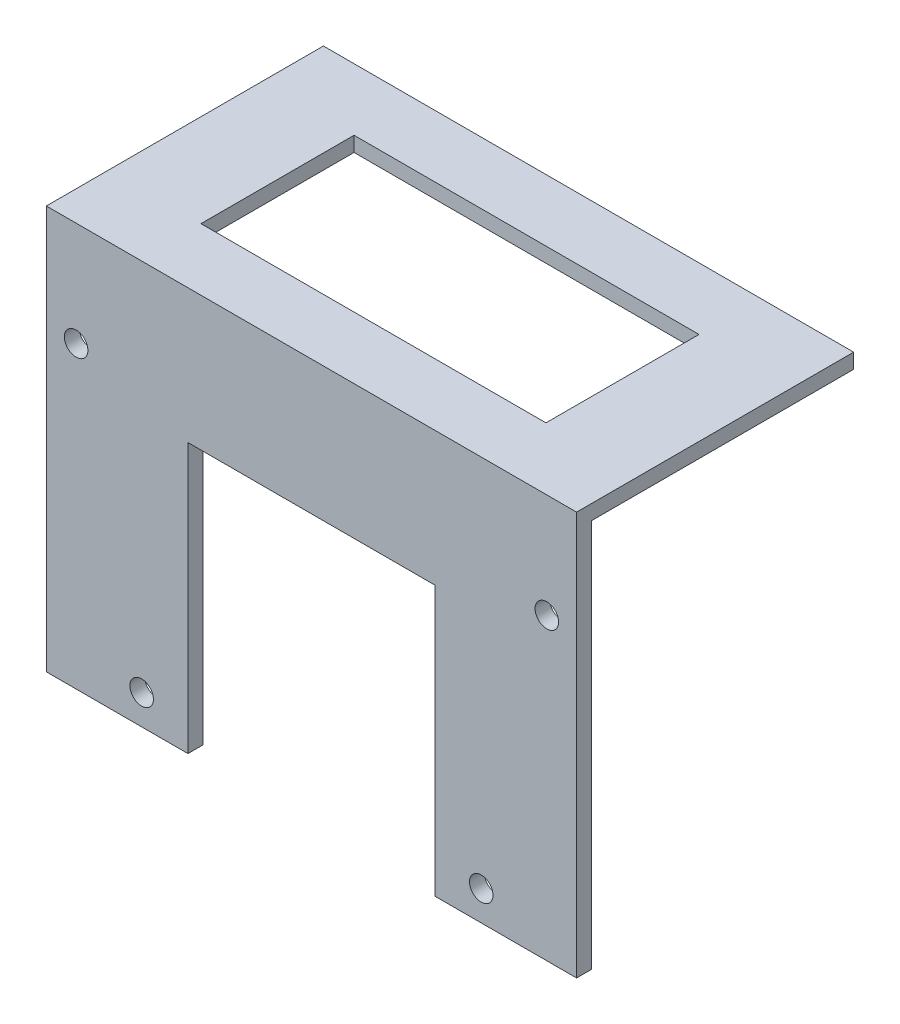
ISO-10303-21;
HEADER;
FILE_DESCRIPTION(('STEP AP214'),'2;1');
FILE_NAME('part.step','',(''),(''),'','','');
FILE_SCHEMA(('AUTOMOTIVE_DESIGN { 1 0 10303 214 1 1 1 1 }'));
ENDSEC;
DATA;
#1=APPLICATION_CONTEXT('core data for automotive mechanical design processes');
#2=APPLICATION_PROTOCOL_DEFINITION('international standard','automotive_design',2000,#1);
#3=PRODUCT_CONTEXT('',#1,'mechanical');
#4=PRODUCT('Part','Part','',(#3));
#5=PRODUCT_RELATED_PRODUCT_CATEGORY('part','',(#4));
#6=PRODUCT_DEFINITION_FORMATION('','',#4);
#7=PRODUCT_DEFINITION_CONTEXT('part definition',#1,'design');
#8=PRODUCT_DEFINITION('design','',#6,#7);
#9=PRODUCT_DEFINITION_SHAPE('','',#8);
#10=(LENGTH_UNIT() NAMED_UNIT(*) SI_UNIT(.MILLI.,.METRE.));
#11=(NAMED_UNIT(*) PLANE_ANGLE_UNIT() SI_UNIT($,.RADIAN.));
#12=(NAMED_UNIT(*) SI_UNIT($,.STERADIAN.) SOLID_ANGLE_UNIT());
#13=UNCERTAINTY_MEASURE_WITH_UNIT(LENGTH_MEASURE(1.E-05),#10,'distance_accuracy_value','');
#14=(GEOMETRIC_REPRESENTATION_CONTEXT(3) GLOBAL_UNCERTAINTY_ASSIGNED_CONTEXT((#13)) GLOBAL_UNIT_ASSIGNED_CONTEXT((#10,
#11,#12)) REPRESENTATION_CONTEXT('',''));
#15=CARTESIAN_POINT('',(0.,0.,0.));
#16=DIRECTION('',(0.,0.,1.));
#17=DIRECTION('',(1.,0.,0.));
#18=AXIS2_PLACEMENT_3D('',#15,#16,#17);
#19=CARTESIAN_POINT('',(-8.910000095367,75.81,-3.175));
#20=DIRECTION('',(-1.,0.,0.));
#21=DIRECTION('',(0.,0.,1.));
#22=AXIS2_PLACEMENT_3D('',#19,#20,#21);
#23=PLANE('',#22);
#24=DIRECTION('',(0.,-1.,0.));
#25=VECTOR('',#24,1.);
#26=CARTESIAN_POINT('',(-8.910000095367,75.81,0.));
#27=LINE('',#26,#25);
#28=CARTESIAN_POINT('',(-8.910000095367,78.985,0.));
#29=VERTEX_POINT('',#28);
#30=CARTESIAN_POINT('',(-8.910000095367,-7.01,0.));
#31=VERTEX_POINT('',#30);
#32=EDGE_CURVE('E211',#29,#31,#27,.T.);
#33=ORIENTED_EDGE('',*,*,#32,.F.);
#34=DIRECTION('',(0.,0.,1.));
#35=VECTOR('',#34,1.);
#36=CARTESIAN_POINT('',(-8.910000095367,78.985,0.));
#37=LINE('',#36,#35);
#38=CARTESIAN_POINT('',(-8.910000095367,78.985,-59.055));
#39=VERTEX_POINT('',#38);
#40=EDGE_CURVE('E166',#39,#29,#37,.T.);
#41=ORIENTED_EDGE('',*,*,#40,.F.);
#42=DIRECTION('',(0.,-1.,0.));
#43=VECTOR('',#42,1.);
#44=CARTESIAN_POINT('',(-8.910000095367,78.985,-59.055));
#45=LINE('',#44,#43);
#46=CARTESIAN_POINT('',(-8.910000095367,75.81,-59.055));
#47=VERTEX_POINT('',#46);
#48=EDGE_CURVE('E178',#39,#47,#45,.T.);
#49=ORIENTED_EDGE('',*,*,#48,.T.);
#50=DIRECTION('',(0.,0.,1.));
#51=VECTOR('',#50,1.);
#52=CARTESIAN_POINT('',(-8.910000095367,75.81,-3.175));
#53=LINE('',#52,#51);
#54=CARTESIAN_POINT('',(-8.910000095367,75.81,-3.175));
#55=VERTEX_POINT('',#54);
#56=EDGE_CURVE('E170',#47,#55,#53,.T.);
#57=ORIENTED_EDGE('',*,*,#56,.T.);
#58=DIRECTION('',(0.,-1.,0.));
#59=VECTOR('',#58,1.);
#60=CARTESIAN_POINT('',(-8.910000095367,75.81,-3.175));
#61=LINE('',#60,#59);
#62=CARTESIAN_POINT('',(-8.910000095367,-7.01,-3.175));
#63=VERTEX_POINT('',#62);
#64=EDGE_CURVE('E214',#55,#63,#61,.T.);
#65=ORIENTED_EDGE('',*,*,#64,.T.);
#66=DIRECTION('',(0.,0.,1.));
#67=VECTOR('',#66,1.);
#68=CARTESIAN_POINT('',(-8.910000095367,-7.01,-3.175));
#69=LINE('',#68,#67);
#70=EDGE_CURVE('E239',#63,#31,#69,.T.);
#71=ORIENTED_EDGE('',*,*,#70,.T.);
#72=EDGE_LOOP('',(#33,#41,#49,#57,#65,#71));
#73=FACE_BOUND('',#72,.T.);
#74=ADVANCED_FACE('F38',(#73),#23,.T.);
#75=CARTESIAN_POINT('',(104.109998474121,75.81,-3.175));
#76=DIRECTION('',(1.,0.,0.));
#77=DIRECTION('',(0.,0.,-1.));
#78=AXIS2_PLACEMENT_3D('',#75,#76,#77);
#79=PLANE('',#78);
#80=DIRECTION('',(0.,1.,0.));
#81=VECTOR('',#80,1.);
#82=CARTESIAN_POINT('',(104.109998474121,75.81,0.));
#83=LINE('',#82,#81);
#84=CARTESIAN_POINT('',(104.109998474121,-7.00999999999994,0.));
#85=VERTEX_POINT('',#84);
#86=CARTESIAN_POINT('',(104.109998474121,78.985,0.));
#87=VERTEX_POINT('',#86);
#88=EDGE_CURVE('E218',#85,#87,#83,.T.);
#89=ORIENTED_EDGE('',*,*,#88,.F.);
#90=DIRECTION('',(0.,0.,1.));
#91=VECTOR('',#90,1.);
#92=CARTESIAN_POINT('',(104.109998474121,-7.00999999999994,-3.175));
#93=LINE('',#92,#91);
#94=CARTESIAN_POINT('',(104.109998474121,-7.00999999999994,-3.175));
#95=VERTEX_POINT('',#94);
#96=EDGE_CURVE('E258',#95,#85,#93,.T.);
#97=ORIENTED_EDGE('',*,*,#96,.F.);
#98=DIRECTION('',(0.,1.,0.));
#99=VECTOR('',#98,1.);
#100=CARTESIAN_POINT('',(104.109998474121,75.81,-3.175));
#101=LINE('',#100,#99);
#102=CARTESIAN_POINT('',(104.109998474121,75.81,-3.175));
#103=VERTEX_POINT('',#102);
#104=EDGE_CURVE('E233',#95,#103,#101,.T.);
#105=ORIENTED_EDGE('',*,*,#104,.T.);
#106=DIRECTION('',(0.,0.,-1.));
#107=VECTOR('',#106,1.);
#108=CARTESIAN_POINT('',(104.109998474121,75.81,-59.055));
#109=LINE('',#108,#107);
#110=CARTESIAN_POINT('',(104.109998474121,75.81,-59.055));
#111=VERTEX_POINT('',#110);
#112=EDGE_CURVE('E163',#103,#111,#109,.T.);
#113=ORIENTED_EDGE('',*,*,#112,.T.);
#114=DIRECTION('',(0.,-1.,0.));
#115=VECTOR('',#114,1.);
#116=CARTESIAN_POINT('',(104.109998474121,78.985,-59.055));
#117=LINE('',#116,#115);
#118=CARTESIAN_POINT('',(104.109998474121,78.985,-59.055));
#119=VERTEX_POINT('',#118);
#120=EDGE_CURVE('E186',#119,#111,#117,.T.);
#121=ORIENTED_EDGE('',*,*,#120,.F.);
#122=DIRECTION('',(0.,0.,-1.));
#123=VECTOR('',#122,1.);
#124=CARTESIAN_POINT('',(104.109998474121,78.985,-59.055));
#125=LINE('',#124,#123);
#126=EDGE_CURVE('E173',#87,#119,#125,.T.);
#127=ORIENTED_EDGE('',*,*,#126,.F.);
#128=EDGE_LOOP('',(#89,#97,#105,#113,#121,#127));
#129=FACE_BOUND('',#128,.T.);
#130=ADVANCED_FACE('F291',(#129),#79,.T.);
#131=CARTESIAN_POINT('',(104.109998474121,-7.00999999999994,-3.175));
#132=DIRECTION('',(0.,-1.,0.));
#133=DIRECTION('',(0.,0.,-1.));
#134=AXIS2_PLACEMENT_3D('',#131,#132,#133);
#135=PLANE('',#134);
#136=DIRECTION('',(1.,0.,0.));
#137=VECTOR('',#136,1.);
#138=CARTESIAN_POINT('',(104.109998474121,-7.00999999999994,0.));
#139=LINE('',#138,#137);
#140=CARTESIAN_POINT('',(73.9315308865306,-7.00999999999994,0.));
#141=VERTEX_POINT('',#140);
#142=EDGE_CURVE('E254',#141,#85,#139,.T.);
#143=ORIENTED_EDGE('',*,*,#142,.F.);
#144=DIRECTION('',(0.,0.,1.));
#145=VECTOR('',#144,1.);
#146=CARTESIAN_POINT('',(73.9315308865306,-7.00999999999994,-3.175));
#147=LINE('',#146,#145);
#148=CARTESIAN_POINT('',(73.9315308865306,-7.00999999999994,-3.175));
#149=VERTEX_POINT('',#148);
#150=EDGE_CURVE('E261',#149,#141,#147,.T.);
#151=ORIENTED_EDGE('',*,*,#150,.F.);
#152=DIRECTION('',(1.,0.,0.));
#153=VECTOR('',#152,1.);
#154=CARTESIAN_POINT('',(104.109998474121,-7.00999999999994,-3.175));
#155=LINE('',#154,#153);
#156=EDGE_CURVE('E230',#149,#95,#155,.T.);
#157=ORIENTED_EDGE('',*,*,#156,.T.);
#158=ORIENTED_EDGE('',*,*,#96,.T.);
#159=EDGE_LOOP('',(#143,#151,#157,#158));
#160=FACE_BOUND('',#159,.T.);
#161=ADVANCED_FACE('F296',(#160),#135,.T.);
#162=CARTESIAN_POINT('',(73.9315308865306,50.41,-3.175));
#163=DIRECTION('',(-1.,0.,0.));
#164=DIRECTION('',(0.,0.,1.));
#165=AXIS2_PLACEMENT_3D('',#162,#163,#164);
#166=PLANE('',#165);
#167=DIRECTION('',(0.,-1.,0.));
#168=VECTOR('',#167,1.);
#169=CARTESIAN_POINT('',(73.9315308865306,50.41,0.));
#170=LINE('',#169,#168);
#171=CARTESIAN_POINT('',(73.9315308865306,50.41,0.));
#172=VERTEX_POINT('',#171);
#173=EDGE_CURVE('E251',#172,#141,#170,.T.);
#174=ORIENTED_EDGE('',*,*,#173,.F.);
#175=DIRECTION('',(0.,0.,1.));
#176=VECTOR('',#175,1.);
#177=CARTESIAN_POINT('',(73.9315308865306,50.41,-3.175));
#178=LINE('',#177,#176);
#179=CARTESIAN_POINT('',(73.9315308865306,50.41,-3.175));
#180=VERTEX_POINT('',#179);
#181=EDGE_CURVE('E263',#180,#172,#178,.T.);
#182=ORIENTED_EDGE('',*,*,#181,.F.);
#183=DIRECTION('',(0.,-1.,0.));
#184=VECTOR('',#183,1.);
#185=CARTESIAN_POINT('',(73.9315308865306,50.41,-3.175));
#186=LINE('',#185,#184);
#187=EDGE_CURVE('E227',#180,#149,#186,.T.);
#188=ORIENTED_EDGE('',*,*,#187,.T.);
#189=ORIENTED_EDGE('',*,*,#150,.T.);
#190=EDGE_LOOP('',(#174,#182,#188,#189));
#191=FACE_BOUND('',#190,.T.);
#192=ADVANCED_FACE('F324',(#191),#166,.T.);
#193=CARTESIAN_POINT('',(21.2684674922234,50.41,-3.175));
#194=DIRECTION('',(0.,-1.,0.));
#195=DIRECTION('',(0.,0.,-1.));
#196=AXIS2_PLACEMENT_3D('',#193,#194,#195);
#197=PLANE('',#196);
#198=DIRECTION('',(1.,0.,0.));
#199=VECTOR('',#198,1.);
#200=CARTESIAN_POINT('',(21.2684674922234,50.41,0.));
#201=LINE('',#200,#199);
#202=CARTESIAN_POINT('',(21.2684674922234,50.41,0.));
#203=VERTEX_POINT('',#202);
#204=EDGE_CURVE('E248',#203,#172,#201,.T.);
#205=ORIENTED_EDGE('',*,*,#204,.F.);
#206=DIRECTION('',(0.,0.,1.));
#207=VECTOR('',#206,1.);
#208=CARTESIAN_POINT('',(21.2684674922234,50.41,-3.175));
#209=LINE('',#208,#207);
#210=CARTESIAN_POINT('',(21.2684674922234,50.41,-3.175));
#211=VERTEX_POINT('',#210);
#212=EDGE_CURVE('E265',#211,#203,#209,.T.);
#213=ORIENTED_EDGE('',*,*,#212,.F.);
#214=DIRECTION('',(1.,0.,0.));
#215=VECTOR('',#214,1.);
#216=CARTESIAN_POINT('',(21.2684674922234,50.41,-3.175));
#217=LINE('',#216,#215);
#218=EDGE_CURVE('E224',#211,#180,#217,.T.);
#219=ORIENTED_EDGE('',*,*,#218,.T.);
#220=ORIENTED_EDGE('',*,*,#181,.T.);
#221=EDGE_LOOP('',(#205,#213,#219,#220));
#222=FACE_BOUND('',#221,.T.);
#223=ADVANCED_FACE('F327',(#222),#197,.T.);
#224=CARTESIAN_POINT('',(21.2684674922234,50.41,-3.175));
#225=DIRECTION('',(1.,0.,0.));
#226=DIRECTION('',(0.,0.,-1.));
#227=AXIS2_PLACEMENT_3D('',#224,#225,#226);
#228=PLANE('',#227);
#229=DIRECTION('',(0.,1.,0.));
#230=VECTOR('',#229,1.);
#231=CARTESIAN_POINT('',(21.2684674922234,50.41,0.));
#232=LINE('',#231,#230);
#233=CARTESIAN_POINT('',(21.2684674922234,-7.01,0.));
#234=VERTEX_POINT('',#233);
#235=EDGE_CURVE('E245',#234,#203,#232,.T.);
#236=ORIENTED_EDGE('',*,*,#235,.F.);
#237=DIRECTION('',(0.,0.,1.));
#238=VECTOR('',#237,1.);
#239=CARTESIAN_POINT('',(21.2684674922234,-7.01,-3.175));
#240=LINE('',#239,#238);
#241=CARTESIAN_POINT('',(21.2684674922234,-7.01,-3.175));
#242=VERTEX_POINT('',#241);
#243=EDGE_CURVE('E267',#242,#234,#240,.T.);
#244=ORIENTED_EDGE('',*,*,#243,.F.);
#245=DIRECTION('',(0.,1.,0.));
#246=VECTOR('',#245,1.);
#247=CARTESIAN_POINT('',(21.2684674922234,50.41,-3.175));
#248=LINE('',#247,#246);
#249=EDGE_CURVE('E221',#242,#211,#248,.T.);
#250=ORIENTED_EDGE('',*,*,#249,.T.);
#251=ORIENTED_EDGE('',*,*,#212,.T.);
#252=EDGE_LOOP('',(#236,#244,#250,#251));
#253=FACE_BOUND('',#252,.T.);
#254=ADVANCED_FACE('F331',(#253),#228,.T.);
#255=CARTESIAN_POINT('',(-8.910000095367,-7.01,-3.175));
#256=DIRECTION('',(0.,-1.,0.));
#257=DIRECTION('',(0.,0.,-1.));
#258=AXIS2_PLACEMENT_3D('',#255,#256,#257);
#259=PLANE('',#258);
#260=DIRECTION('',(1.,0.,0.));
#261=VECTOR('',#260,1.);
#262=CARTESIAN_POINT('',(-8.910000095367,-7.01,0.));
#263=LINE('',#262,#261);
#264=EDGE_CURVE('E242',#31,#234,#263,.T.);
#265=ORIENTED_EDGE('',*,*,#264,.F.);
#266=ORIENTED_EDGE('',*,*,#70,.F.);
#267=DIRECTION('',(1.,0.,0.));
#268=VECTOR('',#267,1.);
#269=CARTESIAN_POINT('',(-8.910000095367,-7.01,-3.175));
#270=LINE('',#269,#268);
#271=EDGE_CURVE('E217',#63,#242,#270,.T.);
#272=ORIENTED_EDGE('',*,*,#271,.T.);
#273=ORIENTED_EDGE('',*,*,#243,.T.);
#274=EDGE_LOOP('',(#265,#266,#272,#273));
#275=FACE_BOUND('',#274,.T.);
#276=ADVANCED_FACE('F333',(#275),#259,.T.);
#277=CARTESIAN_POINT('',(0.,0.,-3.175));
#278=DIRECTION('',(0.,0.,1.));
#279=DIRECTION('',(1.,0.,0.));
#280=AXIS2_PLACEMENT_3D('',#277,#278,#279);
#281=PLANE('',#280);
#282=CARTESIAN_POINT('',(97.759998474121,56.76,-3.175));
#283=DIRECTION('',(0.,0.,1.));
#284=DIRECTION('',(-1.,0.,0.));
#285=AXIS2_PLACEMENT_3D('',#282,#283,#284);
#286=CIRCLE('',#285,2.50800006399999);
#287=CARTESIAN_POINT('',(95.251998410121,56.76,-3.175));
#288=VERTEX_POINT('',#287);
#289=EDGE_CURVE('E190',#288,#288,#286,.T.);
#290=ORIENTED_EDGE('',*,*,#289,.T.);
#291=EDGE_LOOP('',(#290));
#292=FACE_BOUND('',#291,.T.);
#293=CARTESIAN_POINT('',(83.789998474121,-0.659999999999944,-3.175));
#294=DIRECTION('',(0.,0.,1.));
#295=DIRECTION('',(-1.,0.,0.));
#296=AXIS2_PLACEMENT_3D('',#293,#294,#295);
#297=CIRCLE('',#296,2.50800006400001);
#298=CARTESIAN_POINT('',(81.281998410121,-0.659999999999944,-3.175));
#299=VERTEX_POINT('',#298);
#300=EDGE_CURVE('E196',#299,#299,#297,.T.);
#301=ORIENTED_EDGE('',*,*,#300,.T.);
#302=EDGE_LOOP('',(#301));
#303=FACE_BOUND('',#302,.T.);
#304=CARTESIAN_POINT('',(11.409999904633,-0.659999999999999,-3.175));
#305=DIRECTION('',(0.,0.,1.));
#306=DIRECTION('',(1.,0.,0.));
#307=AXIS2_PLACEMENT_3D('',#304,#305,#306);
#308=CIRCLE('',#307,2.508000064);
#309=CARTESIAN_POINT('',(13.917999968633,-0.659999999999999,-3.175));
#310=VERTEX_POINT('',#309);
#311=EDGE_CURVE('E202',#310,#310,#308,.T.);
#312=ORIENTED_EDGE('',*,*,#311,.T.);
#313=EDGE_LOOP('',(#312));
#314=FACE_BOUND('',#313,.T.);
#315=CARTESIAN_POINT('',(-2.560000095367,56.76,-3.175));
#316=DIRECTION('',(0.,0.,1.));
#317=DIRECTION('',(1.,0.,0.));
#318=AXIS2_PLACEMENT_3D('',#315,#316,#317);
#319=CIRCLE('',#318,2.508000064);
#320=CARTESIAN_POINT('',(-0.0520000313669958,56.76,-3.175));
#321=VERTEX_POINT('',#320);
#322=EDGE_CURVE('E208',#321,#321,#319,.T.);
#323=ORIENTED_EDGE('',*,*,#322,.T.);
#324=EDGE_LOOP('',(#323));
#325=FACE_BOUND('',#324,.T.);
#326=ORIENTED_EDGE('',*,*,#64,.F.);
#327=DIRECTION('',(-1.,0.,0.));
#328=VECTOR('',#327,1.);
#329=CARTESIAN_POINT('',(104.109998474121,75.81,-3.175));
#330=LINE('',#329,#328);
#331=EDGE_CURVE('E236',#103,#55,#330,.T.);
#332=ORIENTED_EDGE('',*,*,#331,.F.);
#333=ORIENTED_EDGE('',*,*,#104,.F.);
#334=ORIENTED_EDGE('',*,*,#156,.F.);
#335=ORIENTED_EDGE('',*,*,#187,.F.);
#336=ORIENTED_EDGE('',*,*,#218,.F.);
#337=ORIENTED_EDGE('',*,*,#249,.F.);
#338=ORIENTED_EDGE('',*,*,#271,.F.);
#339=EDGE_LOOP('',(#326,#332,#333,#334,#335,#336,#337,#338));
#340=FACE_BOUND('',#339,.T.);
#341=ADVANCED_FACE('F315',(#292,#303,#314,#325,#340),#281,.F.);
#342=CARTESIAN_POINT('',(0.,0.,0.));
#343=DIRECTION('',(0.,0.,1.));
#344=DIRECTION('',(1.,0.,0.));
#345=AXIS2_PLACEMENT_3D('',#342,#343,#344);
#346=PLANE('',#345);
#347=CARTESIAN_POINT('',(97.759998474121,56.76,0.));
#348=DIRECTION('',(0.,0.,1.));
#349=DIRECTION('',(-1.,0.,0.));
#350=AXIS2_PLACEMENT_3D('',#347,#348,#349);
#351=CIRCLE('',#350,2.50800006399999);
#352=CARTESIAN_POINT('',(95.251998410121,56.76,0.));
#353=VERTEX_POINT('',#352);
#354=EDGE_CURVE('E189',#353,#353,#351,.T.);
#355=ORIENTED_EDGE('',*,*,#354,.F.);
#356=EDGE_LOOP('',(#355));
#357=FACE_BOUND('',#356,.T.);
#358=CARTESIAN_POINT('',(83.789998474121,-0.659999999999944,0.));
#359=DIRECTION('',(0.,0.,1.));
#360=DIRECTION('',(-1.,0.,0.));
#361=AXIS2_PLACEMENT_3D('',#358,#359,#360);
#362=CIRCLE('',#361,2.50800006400001);
#363=CARTESIAN_POINT('',(81.281998410121,-0.659999999999944,0.));
#364=VERTEX_POINT('',#363);
#365=EDGE_CURVE('E193',#364,#364,#362,.T.);
#366=ORIENTED_EDGE('',*,*,#365,.F.);
#367=EDGE_LOOP('',(#366));
#368=FACE_BOUND('',#367,.T.);
#369=CARTESIAN_POINT('',(11.409999904633,-0.659999999999999,0.));
#370=DIRECTION('',(0.,0.,1.));
#371=DIRECTION('',(1.,0.,0.));
#372=AXIS2_PLACEMENT_3D('',#369,#370,#371);
#373=CIRCLE('',#372,2.508000064);
#374=CARTESIAN_POINT('',(13.917999968633,-0.659999999999999,0.));
#375=VERTEX_POINT('',#374);
#376=EDGE_CURVE('E199',#375,#375,#373,.T.);
#377=ORIENTED_EDGE('',*,*,#376,.F.);
#378=EDGE_LOOP('',(#377));
#379=FACE_BOUND('',#378,.T.);
#380=CARTESIAN_POINT('',(-2.560000095367,56.76,0.));
#381=DIRECTION('',(0.,0.,1.));
#382=DIRECTION('',(1.,0.,0.));
#383=AXIS2_PLACEMENT_3D('',#380,#381,#382);
#384=CIRCLE('',#383,2.508000064);
#385=CARTESIAN_POINT('',(-0.0520000313669958,56.76,0.));
#386=VERTEX_POINT('',#385);
#387=EDGE_CURVE('E205',#386,#386,#384,.T.);
#388=ORIENTED_EDGE('',*,*,#387,.F.);
#389=EDGE_LOOP('',(#388));
#390=FACE_BOUND('',#389,.T.);
#391=ORIENTED_EDGE('',*,*,#32,.T.);
#392=ORIENTED_EDGE('',*,*,#264,.T.);
#393=ORIENTED_EDGE('',*,*,#235,.T.);
#394=ORIENTED_EDGE('',*,*,#204,.T.);
#395=ORIENTED_EDGE('',*,*,#173,.T.);
#396=ORIENTED_EDGE('',*,*,#142,.T.);
#397=ORIENTED_EDGE('',*,*,#88,.T.);
#398=DIRECTION('',(1.,0.,0.));
#399=VECTOR('',#398,1.);
#400=CARTESIAN_POINT('',(104.109998474121,78.985,0.));
#401=LINE('',#400,#399);
#402=EDGE_CURVE('E169',#29,#87,#401,.T.);
#403=ORIENTED_EDGE('',*,*,#402,.F.);
#404=EDGE_LOOP('',(#391,#392,#393,#394,#395,#396,#397,#403));
#405=FACE_BOUND('',#404,.T.);
#406=ADVANCED_FACE('F302',(#357,#368,#379,#390,#405),#346,.T.);
#407=CARTESIAN_POINT('',(-2.560000095367,56.76,-3.175));
#408=DIRECTION('',(0.,0.,1.));
#409=DIRECTION('',(1.,0.,0.));
#410=AXIS2_PLACEMENT_3D('',#407,#408,#409);
#411=CYLINDRICAL_SURFACE('',#410,2.508000064);
#412=ORIENTED_EDGE('',*,*,#322,.F.);
#413=EDGE_LOOP('',(#412));
#414=FACE_BOUND('',#413,.T.);
#415=ORIENTED_EDGE('',*,*,#387,.T.);
#416=EDGE_LOOP('',(#415));
#417=FACE_BOUND('',#416,.T.);
#418=ADVANCED_FACE('F350',(#414,#417),#411,.F.);
#419=CARTESIAN_POINT('',(11.409999904633,-0.659999999999999,-3.175));
#420=DIRECTION('',(0.,0.,1.));
#421=DIRECTION('',(1.,0.,0.));
#422=AXIS2_PLACEMENT_3D('',#419,#420,#421);
#423=CYLINDRICAL_SURFACE('',#422,2.508000064);
#424=ORIENTED_EDGE('',*,*,#311,.F.);
#425=EDGE_LOOP('',(#424));
#426=FACE_BOUND('',#425,.T.);
#427=ORIENTED_EDGE('',*,*,#376,.T.);
#428=EDGE_LOOP('',(#427));
#429=FACE_BOUND('',#428,.T.);
#430=ADVANCED_FACE('F355',(#426,#429),#423,.F.);
#431=CARTESIAN_POINT('',(83.789998474121,-0.659999999999944,-3.175));
#432=DIRECTION('',(0.,0.,1.));
#433=DIRECTION('',(1.,0.,0.));
#434=AXIS2_PLACEMENT_3D('',#431,#432,#433);
#435=CYLINDRICAL_SURFACE('',#434,2.50800006400001);
#436=ORIENTED_EDGE('',*,*,#300,.F.);
#437=EDGE_LOOP('',(#436));
#438=FACE_BOUND('',#437,.T.);
#439=ORIENTED_EDGE('',*,*,#365,.T.);
#440=EDGE_LOOP('',(#439));
#441=FACE_BOUND('',#440,.T.);
#442=ADVANCED_FACE('F359',(#438,#441),#435,.F.);
#443=CARTESIAN_POINT('',(97.759998474121,56.76,-3.175));
#444=DIRECTION('',(0.,0.,1.));
#445=DIRECTION('',(1.,0.,0.));
#446=AXIS2_PLACEMENT_3D('',#443,#444,#445);
#447=CYLINDRICAL_SURFACE('',#446,2.50800006399999);
#448=ORIENTED_EDGE('',*,*,#289,.F.);
#449=EDGE_LOOP('',(#448));
#450=FACE_BOUND('',#449,.T.);
#451=ORIENTED_EDGE('',*,*,#354,.T.);
#452=EDGE_LOOP('',(#451));
#453=FACE_BOUND('',#452,.T.);
#454=ADVANCED_FACE('F363',(#450,#453),#447,.F.);
#455=CARTESIAN_POINT('',(-8.910000095367,78.985,-59.055));
#456=DIRECTION('',(0.,0.,1.));
#457=DIRECTION('',(1.,0.,0.));
#458=AXIS2_PLACEMENT_3D('',#455,#456,#457);
#459=PLANE('',#458);
#460=DIRECTION('',(-1.,0.,0.));
#461=VECTOR('',#460,1.);
#462=CARTESIAN_POINT('',(-8.910000095367,75.81,-59.055));
#463=LINE('',#462,#461);
#464=EDGE_CURVE('E180',#111,#47,#463,.T.);
#465=ORIENTED_EDGE('',*,*,#464,.T.);
#466=ORIENTED_EDGE('',*,*,#48,.F.);
#467=DIRECTION('',(-1.,0.,0.));
#468=VECTOR('',#467,1.);
#469=CARTESIAN_POINT('',(-8.910000095367,78.985,-59.055));
#470=LINE('',#469,#468);
#471=EDGE_CURVE('E175',#119,#39,#470,.T.);
#472=ORIENTED_EDGE('',*,*,#471,.F.);
#473=ORIENTED_EDGE('',*,*,#120,.T.);
#474=EDGE_LOOP('',(#465,#466,#472,#473));
#475=FACE_BOUND('',#474,.T.);
#476=ADVANCED_FACE('F309',(#475),#459,.F.);
#477=CARTESIAN_POINT('',(0.,78.985,0.));
#478=DIRECTION('',(0.,-1.,0.));
#479=DIRECTION('',(0.,0.,-1.));
#480=AXIS2_PLACEMENT_3D('',#477,#478,#479);
#481=PLANE('',#480);
#482=DIRECTION('',(-1.,0.,0.));
#483=VECTOR('',#482,1.);
#484=CARTESIAN_POINT('',(10.8357125386662,78.985,-45.8437602452125));
#485=LINE('',#484,#483);
#486=CARTESIAN_POINT('',(84.3642858400878,78.985,-45.8437602452125));
#487=VERTEX_POINT('',#486);
#488=CARTESIAN_POINT('',(10.8357125386662,78.985,-45.8437602452125));
#489=VERTEX_POINT('',#488);
#490=EDGE_CURVE('E149',#487,#489,#485,.T.);
#491=ORIENTED_EDGE('',*,*,#490,.F.);
#492=DIRECTION('',(0.,0.,-1.));
#493=VECTOR('',#492,1.);
#494=CARTESIAN_POINT('',(84.3642858400878,78.985,-13.2112397547875));
#495=LINE('',#494,#493);
#496=CARTESIAN_POINT('',(84.3642858400878,78.985,-13.2112397547875));
#497=VERTEX_POINT('',#496);
#498=EDGE_CURVE('E52',#497,#487,#495,.T.);
#499=ORIENTED_EDGE('',*,*,#498,.F.);
#500=DIRECTION('',(1.,0.,0.));
#501=VECTOR('',#500,1.);
#502=CARTESIAN_POINT('',(10.8357125386662,78.985,-13.2112397547875));
#503=LINE('',#502,#501);
#504=CARTESIAN_POINT('',(10.8357125386662,78.985,-13.2112397547875));
#505=VERTEX_POINT('',#504);
#506=EDGE_CURVE('E156',#505,#497,#503,.T.);
#507=ORIENTED_EDGE('',*,*,#506,.F.);
#508=DIRECTION('',(0.,0.,1.));
#509=VECTOR('',#508,1.);
#510=CARTESIAN_POINT('',(10.8357125386662,78.985,-13.2112397547875));
#511=LINE('',#510,#509);
#512=EDGE_CURVE('E140',#489,#505,#511,.T.);
#513=ORIENTED_EDGE('',*,*,#512,.F.);
#514=EDGE_LOOP('',(#491,#499,#507,#513));
#515=FACE_BOUND('',#514,.T.);
#516=ORIENTED_EDGE('',*,*,#40,.T.);
#517=ORIENTED_EDGE('',*,*,#402,.T.);
#518=ORIENTED_EDGE('',*,*,#126,.T.);
#519=ORIENTED_EDGE('',*,*,#471,.T.);
#520=EDGE_LOOP('',(#516,#517,#518,#519));
#521=FACE_BOUND('',#520,.T.);
#522=ADVANCED_FACE('F153',(#515,#521),#481,.F.);
#523=CARTESIAN_POINT('',(0.,75.81,0.));
#524=DIRECTION('',(0.,-1.,0.));
#525=DIRECTION('',(0.,0.,-1.));
#526=AXIS2_PLACEMENT_3D('',#523,#524,#525);
#527=PLANE('',#526);
#528=DIRECTION('',(0.,0.,1.));
#529=VECTOR('',#528,1.);
#530=CARTESIAN_POINT('',(84.3642858400878,75.81,0.));
#531=LINE('',#530,#529);
#532=CARTESIAN_POINT('',(84.3642858400878,75.81,-45.8437602452125));
#533=VERTEX_POINT('',#532);
#534=CARTESIAN_POINT('',(84.3642858400878,75.81,-13.2112397547875));
#535=VERTEX_POINT('',#534);
#536=EDGE_CURVE('E11',#533,#535,#531,.T.);
#537=ORIENTED_EDGE('',*,*,#536,.F.);
#538=DIRECTION('',(1.,0.,0.));
#539=VECTOR('',#538,1.);
#540=CARTESIAN_POINT('',(0.,75.81,-45.8437602452125));
#541=LINE('',#540,#539);
#542=CARTESIAN_POINT('',(10.8357125386662,75.81,-45.8437602452125));
#543=VERTEX_POINT('',#542);
#544=EDGE_CURVE('E260',#543,#533,#541,.T.);
#545=ORIENTED_EDGE('',*,*,#544,.F.);
#546=DIRECTION('',(0.,0.,-1.));
#547=VECTOR('',#546,1.);
#548=CARTESIAN_POINT('',(10.8357125386662,75.81,0.));
#549=LINE('',#548,#547);
#550=CARTESIAN_POINT('',(10.8357125386662,75.81,-13.2112397547875));
#551=VERTEX_POINT('',#550);
#552=EDGE_CURVE('E143',#551,#543,#549,.T.);
#553=ORIENTED_EDGE('',*,*,#552,.F.);
#554=DIRECTION('',(-1.,0.,0.));
#555=VECTOR('',#554,1.);
#556=CARTESIAN_POINT('',(0.,75.81,-13.2112397547875));
#557=LINE('',#556,#555);
#558=EDGE_CURVE('E45',#535,#551,#557,.T.);
#559=ORIENTED_EDGE('',*,*,#558,.F.);
#560=EDGE_LOOP('',(#537,#545,#553,#559));
#561=FACE_BOUND('',#560,.T.);
#562=ORIENTED_EDGE('',*,*,#112,.F.);
#563=ORIENTED_EDGE('',*,*,#331,.T.);
#564=ORIENTED_EDGE('',*,*,#56,.F.);
#565=ORIENTED_EDGE('',*,*,#464,.F.);
#566=EDGE_LOOP('',(#562,#563,#564,#565));
#567=FACE_BOUND('',#566,.T.);
#568=ADVANCED_FACE('F277',(#561,#567),#527,.T.);
#569=CARTESIAN_POINT('',(84.3642858400878,-7.01,-13.2112397547875));
#570=DIRECTION('',(1.,0.,0.));
#571=DIRECTION('',(0.,0.,-1.));
#572=AXIS2_PLACEMENT_3D('',#569,#570,#571);
#573=PLANE('',#572);
#574=ORIENTED_EDGE('',*,*,#536,.T.);
#575=DIRECTION('',(0.,1.,0.));
#576=VECTOR('',#575,1.);
#577=CARTESIAN_POINT('',(84.3642858400878,-7.01,-13.2112397547875));
#578=LINE('',#577,#576);
#579=EDGE_CURVE('E161',#535,#497,#578,.T.);
#580=ORIENTED_EDGE('',*,*,#579,.T.);
#581=ORIENTED_EDGE('',*,*,#498,.T.);
#582=DIRECTION('',(0.,1.,0.));
#583=VECTOR('',#582,1.);
#584=CARTESIAN_POINT('',(84.3642858400878,-7.01,-45.8437602452125));
#585=LINE('',#584,#583);
#586=EDGE_CURVE('E146',#533,#487,#585,.T.);
#587=ORIENTED_EDGE('',*,*,#586,.F.);
#588=EDGE_LOOP('',(#574,#580,#581,#587));
#589=FACE_BOUND('',#588,.T.);
#590=ADVANCED_FACE('F279',(#589),#573,.F.);
#591=CARTESIAN_POINT('',(10.8357125386662,-7.01,-13.2112397547875));
#592=DIRECTION('',(0.,0.,1.));
#593=DIRECTION('',(1.,0.,0.));
#594=AXIS2_PLACEMENT_3D('',#591,#592,#593);
#595=PLANE('',#594);
#596=ORIENTED_EDGE('',*,*,#558,.T.);
#597=DIRECTION('',(0.,1.,0.));
#598=VECTOR('',#597,1.);
#599=CARTESIAN_POINT('',(10.8357125386662,-7.01,-13.2112397547875));
#600=LINE('',#599,#598);
#601=EDGE_CURVE('E145',#551,#505,#600,.T.);
#602=ORIENTED_EDGE('',*,*,#601,.T.);
#603=ORIENTED_EDGE('',*,*,#506,.T.);
#604=ORIENTED_EDGE('',*,*,#579,.F.);
#605=EDGE_LOOP('',(#596,#602,#603,#604));
#606=FACE_BOUND('',#605,.T.);
#607=ADVANCED_FACE('F274',(#606),#595,.F.);
#608=CARTESIAN_POINT('',(10.8357125386662,-7.01,-13.2112397547875));
#609=DIRECTION('',(-1.,0.,0.));
#610=DIRECTION('',(0.,0.,1.));
#611=AXIS2_PLACEMENT_3D('',#608,#609,#610);
#612=PLANE('',#611);
#613=ORIENTED_EDGE('',*,*,#552,.T.);
#614=DIRECTION('',(0.,1.,0.));
#615=VECTOR('',#614,1.);
#616=CARTESIAN_POINT('',(10.8357125386662,-7.01,-45.8437602452125));
#617=LINE('',#616,#615);
#618=EDGE_CURVE('E60',#543,#489,#617,.T.);
#619=ORIENTED_EDGE('',*,*,#618,.T.);
#620=ORIENTED_EDGE('',*,*,#512,.T.);
#621=ORIENTED_EDGE('',*,*,#601,.F.);
#622=EDGE_LOOP('',(#613,#619,#620,#621));
#623=FACE_BOUND('',#622,.T.);
#624=ADVANCED_FACE('F137',(#623),#612,.F.);
#625=CARTESIAN_POINT('',(10.8357125386662,-7.01,-45.8437602452125));
#626=DIRECTION('',(0.,0.,-1.));
#627=DIRECTION('',(-1.,0.,0.));
#628=AXIS2_PLACEMENT_3D('',#625,#626,#627);
#629=PLANE('',#628);
#630=ORIENTED_EDGE('',*,*,#544,.T.);
#631=ORIENTED_EDGE('',*,*,#586,.T.);
#632=ORIENTED_EDGE('',*,*,#490,.T.);
#633=ORIENTED_EDGE('',*,*,#618,.F.);
#634=EDGE_LOOP('',(#630,#631,#632,#633));
#635=FACE_BOUND('',#634,.T.);
#636=ADVANCED_FACE('F150',(#635),#629,.F.);
#637=CLOSED_SHELL('',(#74,#130,#161,#192,#223,#254,#276,#341,#406,#418,#430,#442,#454,#476,#522,
#568,#590,#607,#624,#636));
#638=MANIFOLD_SOLID_BREP('B2',#637);
#639=ADVANCED_BREP_SHAPE_REPRESENTATION('',(#18,#638),#14);
#640=SHAPE_DEFINITION_REPRESENTATION(#9,#639);
ENDSEC;
END-ISO-10303-21;
